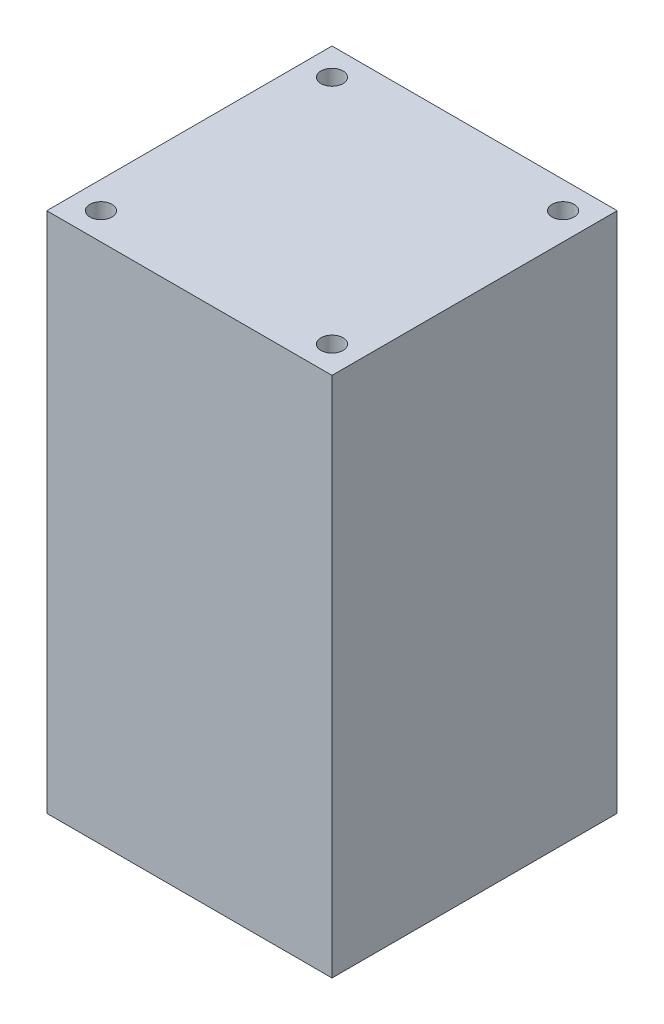
ISO-10303-21;
HEADER;
FILE_DESCRIPTION(('STEP AP214'),'2;1');
FILE_NAME('part.step','',(''),(''),'','','');
FILE_SCHEMA(('AUTOMOTIVE_DESIGN { 1 0 10303 214 1 1 1 1 }'));
ENDSEC;
DATA;
#1=APPLICATION_CONTEXT('core data for automotive mechanical design processes');
#2=APPLICATION_PROTOCOL_DEFINITION('international standard','automotive_design',2000,#1);
#3=PRODUCT_CONTEXT('',#1,'mechanical');
#4=PRODUCT('Part','Part','',(#3));
#5=PRODUCT_RELATED_PRODUCT_CATEGORY('part','',(#4));
#6=PRODUCT_DEFINITION_FORMATION('','',#4);
#7=PRODUCT_DEFINITION_CONTEXT('part definition',#1,'design');
#8=PRODUCT_DEFINITION('design','',#6,#7);
#9=PRODUCT_DEFINITION_SHAPE('','',#8);
#10=(LENGTH_UNIT() NAMED_UNIT(*) SI_UNIT(.MILLI.,.METRE.));
#11=(NAMED_UNIT(*) PLANE_ANGLE_UNIT() SI_UNIT($,.RADIAN.));
#12=(NAMED_UNIT(*) SI_UNIT($,.STERADIAN.) SOLID_ANGLE_UNIT());
#13=UNCERTAINTY_MEASURE_WITH_UNIT(LENGTH_MEASURE(1.E-05),#10,'distance_accuracy_value','');
#14=(GEOMETRIC_REPRESENTATION_CONTEXT(3) GLOBAL_UNCERTAINTY_ASSIGNED_CONTEXT((#13)) GLOBAL_UNIT_ASSIGNED_CONTEXT((#10,
#11,#12)) REPRESENTATION_CONTEXT('',''));
#15=CARTESIAN_POINT('',(0.,0.,0.));
#16=DIRECTION('',(0.,0.,1.));
#17=DIRECTION('',(1.,0.,0.));
#18=AXIS2_PLACEMENT_3D('',#15,#16,#17);
#19=CARTESIAN_POINT('',(54.93,-201.,54.93));
#20=DIRECTION('',(1.,0.,0.));
#21=DIRECTION('',(0.,0.,-1.));
#22=AXIS2_PLACEMENT_3D('',#19,#20,#21);
#23=PLANE('',#22);
#24=DIRECTION('',(0.,0.,-1.));
#25=VECTOR('',#24,1.);
#26=CARTESIAN_POINT('',(54.93,0.,54.93));
#27=LINE('',#26,#25);
#28=CARTESIAN_POINT('',(54.93,0.,54.93));
#29=VERTEX_POINT('',#28);
#30=CARTESIAN_POINT('',(54.93,0.,-54.93));
#31=VERTEX_POINT('',#30);
#32=EDGE_CURVE('E98',#29,#31,#27,.T.);
#33=ORIENTED_EDGE('',*,*,#32,.F.);
#34=DIRECTION('',(0.,1.,0.));
#35=VECTOR('',#34,1.);
#36=CARTESIAN_POINT('',(54.93,-201.,54.93));
#37=LINE('',#36,#35);
#38=CARTESIAN_POINT('',(54.93,-201.,54.93));
#39=VERTEX_POINT('',#38);
#40=EDGE_CURVE('E11',#39,#29,#37,.T.);
#41=ORIENTED_EDGE('',*,*,#40,.F.);
#42=DIRECTION('',(0.,0.,-1.));
#43=VECTOR('',#42,1.);
#44=CARTESIAN_POINT('',(54.93,-201.,54.93));
#45=LINE('',#44,#43);
#46=CARTESIAN_POINT('',(54.93,-201.,-54.93));
#47=VERTEX_POINT('',#46);
#48=EDGE_CURVE('E91',#39,#47,#45,.T.);
#49=ORIENTED_EDGE('',*,*,#48,.T.);
#50=DIRECTION('',(0.,1.,0.));
#51=VECTOR('',#50,1.);
#52=CARTESIAN_POINT('',(54.93,-201.,-54.93));
#53=LINE('',#52,#51);
#54=EDGE_CURVE('E36',#47,#31,#53,.T.);
#55=ORIENTED_EDGE('',*,*,#54,.T.);
#56=EDGE_LOOP('',(#33,#41,#49,#55));
#57=FACE_BOUND('',#56,.T.);
#58=ADVANCED_FACE('F33',(#57),#23,.T.);
#59=CARTESIAN_POINT('',(-54.93,-201.,54.93));
#60=DIRECTION('',(0.,0.,1.));
#61=DIRECTION('',(1.,0.,0.));
#62=AXIS2_PLACEMENT_3D('',#59,#60,#61);
#63=PLANE('',#62);
#64=DIRECTION('',(1.,0.,0.));
#65=VECTOR('',#64,1.);
#66=CARTESIAN_POINT('',(-54.93,0.,54.93));
#67=LINE('',#66,#65);
#68=CARTESIAN_POINT('',(-54.93,0.,54.93));
#69=VERTEX_POINT('',#68);
#70=EDGE_CURVE('E93',#69,#29,#67,.T.);
#71=ORIENTED_EDGE('',*,*,#70,.F.);
#72=DIRECTION('',(0.,1.,0.));
#73=VECTOR('',#72,1.);
#74=CARTESIAN_POINT('',(-54.93,-201.,54.93));
#75=LINE('',#74,#73);
#76=CARTESIAN_POINT('',(-54.93,-201.,54.93));
#77=VERTEX_POINT('',#76);
#78=EDGE_CURVE('E42',#77,#69,#75,.T.);
#79=ORIENTED_EDGE('',*,*,#78,.F.);
#80=DIRECTION('',(1.,0.,0.));
#81=VECTOR('',#80,1.);
#82=CARTESIAN_POINT('',(-54.93,-201.,54.93));
#83=LINE('',#82,#81);
#84=EDGE_CURVE('E88',#77,#39,#83,.T.);
#85=ORIENTED_EDGE('',*,*,#84,.T.);
#86=ORIENTED_EDGE('',*,*,#40,.T.);
#87=EDGE_LOOP('',(#71,#79,#85,#86));
#88=FACE_BOUND('',#87,.T.);
#89=ADVANCED_FACE('F109',(#88),#63,.T.);
#90=CARTESIAN_POINT('',(-54.93,-201.,54.93));
#91=DIRECTION('',(-1.,0.,0.));
#92=DIRECTION('',(0.,0.,1.));
#93=AXIS2_PLACEMENT_3D('',#90,#91,#92);
#94=PLANE('',#93);
#95=DIRECTION('',(0.,0.,1.));
#96=VECTOR('',#95,1.);
#97=CARTESIAN_POINT('',(-54.93,0.,54.93));
#98=LINE('',#97,#96);
#99=CARTESIAN_POINT('',(-54.93,0.,-54.93));
#100=VERTEX_POINT('',#99);
#101=EDGE_CURVE('E83',#100,#69,#98,.T.);
#102=ORIENTED_EDGE('',*,*,#101,.F.);
#103=DIRECTION('',(0.,1.,0.));
#104=VECTOR('',#103,1.);
#105=CARTESIAN_POINT('',(-54.93,-201.,-54.93));
#106=LINE('',#105,#104);
#107=CARTESIAN_POINT('',(-54.93,-201.,-54.93));
#108=VERTEX_POINT('',#107);
#109=EDGE_CURVE('E78',#108,#100,#106,.T.);
#110=ORIENTED_EDGE('',*,*,#109,.F.);
#111=DIRECTION('',(0.,0.,1.));
#112=VECTOR('',#111,1.);
#113=CARTESIAN_POINT('',(-54.93,-201.,54.93));
#114=LINE('',#113,#112);
#115=EDGE_CURVE('E81',#108,#77,#114,.T.);
#116=ORIENTED_EDGE('',*,*,#115,.T.);
#117=ORIENTED_EDGE('',*,*,#78,.T.);
#118=EDGE_LOOP('',(#102,#110,#116,#117));
#119=FACE_BOUND('',#118,.T.);
#120=ADVANCED_FACE('F80',(#119),#94,.T.);
#121=CARTESIAN_POINT('',(-54.93,-201.,-54.93));
#122=DIRECTION('',(0.,0.,-1.));
#123=DIRECTION('',(-1.,0.,0.));
#124=AXIS2_PLACEMENT_3D('',#121,#122,#123);
#125=PLANE('',#124);
#126=DIRECTION('',(-1.,0.,0.));
#127=VECTOR('',#126,1.);
#128=CARTESIAN_POINT('',(-54.93,0.,-54.93));
#129=LINE('',#128,#127);
#130=EDGE_CURVE('E101',#31,#100,#129,.T.);
#131=ORIENTED_EDGE('',*,*,#130,.F.);
#132=ORIENTED_EDGE('',*,*,#54,.F.);
#133=DIRECTION('',(-1.,0.,0.));
#134=VECTOR('',#133,1.);
#135=CARTESIAN_POINT('',(-54.93,-201.,-54.93));
#136=LINE('',#135,#134);
#137=EDGE_CURVE('E87',#47,#108,#136,.T.);
#138=ORIENTED_EDGE('',*,*,#137,.T.);
#139=ORIENTED_EDGE('',*,*,#109,.T.);
#140=EDGE_LOOP('',(#131,#132,#138,#139));
#141=FACE_BOUND('',#140,.T.);
#142=ADVANCED_FACE('F90',(#141),#125,.T.);
#143=CARTESIAN_POINT('',(0.,-201.,0.));
#144=DIRECTION('',(0.,-1.,0.));
#145=DIRECTION('',(0.,0.,-1.));
#146=AXIS2_PLACEMENT_3D('',#143,#144,#145);
#147=PLANE('',#146);
#148=CARTESIAN_POINT('',(-44.5,-201.,44.5));
#149=DIRECTION('',(0.,1.,0.));
#150=DIRECTION('',(0.,0.,1.));
#151=AXIS2_PLACEMENT_3D('',#148,#149,#150);
#152=CIRCLE('',#151,4.25000000000001);
#153=CARTESIAN_POINT('',(-44.5,-201.,48.75));
#154=VERTEX_POINT('',#153);
#155=EDGE_CURVE('E150',#154,#154,#152,.T.);
#156=ORIENTED_EDGE('',*,*,#155,.T.);
#157=EDGE_LOOP('',(#156));
#158=FACE_BOUND('',#157,.T.);
#159=CARTESIAN_POINT('',(44.5,-201.,44.5));
#160=DIRECTION('',(0.,1.,0.));
#161=DIRECTION('',(0.,0.,1.));
#162=AXIS2_PLACEMENT_3D('',#159,#160,#161);
#163=CIRCLE('',#162,4.25000000000001);
#164=CARTESIAN_POINT('',(44.5,-201.,48.75));
#165=VERTEX_POINT('',#164);
#166=EDGE_CURVE('E158',#165,#165,#163,.T.);
#167=ORIENTED_EDGE('',*,*,#166,.T.);
#168=EDGE_LOOP('',(#167));
#169=FACE_BOUND('',#168,.T.);
#170=CARTESIAN_POINT('',(44.5,-201.,-44.5));
#171=DIRECTION('',(0.,1.,0.));
#172=DIRECTION('',(0.,0.,1.));
#173=AXIS2_PLACEMENT_3D('',#170,#171,#172);
#174=CIRCLE('',#173,4.25000000000001);
#175=CARTESIAN_POINT('',(44.5,-201.,-40.25));
#176=VERTEX_POINT('',#175);
#177=EDGE_CURVE('E164',#176,#176,#174,.T.);
#178=ORIENTED_EDGE('',*,*,#177,.T.);
#179=EDGE_LOOP('',(#178));
#180=FACE_BOUND('',#179,.T.);
#181=CARTESIAN_POINT('',(-44.5,-201.,-44.5));
#182=DIRECTION('',(0.,1.,0.));
#183=DIRECTION('',(0.,0.,1.));
#184=AXIS2_PLACEMENT_3D('',#181,#182,#183);
#185=CIRCLE('',#184,4.25000000000001);
#186=CARTESIAN_POINT('',(-44.5,-201.,-40.25));
#187=VERTEX_POINT('',#186);
#188=EDGE_CURVE('E102',#187,#187,#185,.T.);
#189=ORIENTED_EDGE('',*,*,#188,.T.);
#190=EDGE_LOOP('',(#189));
#191=FACE_BOUND('',#190,.T.);
#192=ORIENTED_EDGE('',*,*,#48,.F.);
#193=ORIENTED_EDGE('',*,*,#84,.F.);
#194=ORIENTED_EDGE('',*,*,#115,.F.);
#195=ORIENTED_EDGE('',*,*,#137,.F.);
#196=EDGE_LOOP('',(#192,#193,#194,#195));
#197=FACE_BOUND('',#196,.T.);
#198=ADVANCED_FACE('F86',(#158,#169,#180,#191,#197),#147,.T.);
#199=CARTESIAN_POINT('',(0.,0.,0.));
#200=DIRECTION('',(0.,-1.,0.));
#201=DIRECTION('',(0.,0.,-1.));
#202=AXIS2_PLACEMENT_3D('',#199,#200,#201);
#203=PLANE('',#202);
#204=CARTESIAN_POINT('',(-44.5,0.,44.5));
#205=DIRECTION('',(0.,1.,0.));
#206=DIRECTION('',(0.,0.,1.));
#207=AXIS2_PLACEMENT_3D('',#204,#205,#206);
#208=CIRCLE('',#207,4.25000000000001);
#209=CARTESIAN_POINT('',(-44.5,0.,48.75));
#210=VERTEX_POINT('',#209);
#211=EDGE_CURVE('E153',#210,#210,#208,.T.);
#212=ORIENTED_EDGE('',*,*,#211,.F.);
#213=EDGE_LOOP('',(#212));
#214=FACE_BOUND('',#213,.T.);
#215=CARTESIAN_POINT('',(44.5,0.,44.5));
#216=DIRECTION('',(0.,1.,0.));
#217=DIRECTION('',(0.,0.,1.));
#218=AXIS2_PLACEMENT_3D('',#215,#216,#217);
#219=CIRCLE('',#218,4.25000000000001);
#220=CARTESIAN_POINT('',(44.5,0.,48.75));
#221=VERTEX_POINT('',#220);
#222=EDGE_CURVE('E155',#221,#221,#219,.T.);
#223=ORIENTED_EDGE('',*,*,#222,.F.);
#224=EDGE_LOOP('',(#223));
#225=FACE_BOUND('',#224,.T.);
#226=CARTESIAN_POINT('',(44.5,0.,-44.5));
#227=DIRECTION('',(0.,1.,0.));
#228=DIRECTION('',(0.,0.,1.));
#229=AXIS2_PLACEMENT_3D('',#226,#227,#228);
#230=CIRCLE('',#229,4.25000000000001);
#231=CARTESIAN_POINT('',(44.5,0.,-40.25));
#232=VERTEX_POINT('',#231);
#233=EDGE_CURVE('E161',#232,#232,#230,.T.);
#234=ORIENTED_EDGE('',*,*,#233,.F.);
#235=EDGE_LOOP('',(#234));
#236=FACE_BOUND('',#235,.T.);
#237=CARTESIAN_POINT('',(-44.5,0.,-44.5));
#238=DIRECTION('',(0.,1.,0.));
#239=DIRECTION('',(0.,0.,1.));
#240=AXIS2_PLACEMENT_3D('',#237,#238,#239);
#241=CIRCLE('',#240,4.25000000000001);
#242=CARTESIAN_POINT('',(-44.5,0.,-40.25));
#243=VERTEX_POINT('',#242);
#244=EDGE_CURVE('E167',#243,#243,#241,.T.);
#245=ORIENTED_EDGE('',*,*,#244,.F.);
#246=EDGE_LOOP('',(#245));
#247=FACE_BOUND('',#246,.T.);
#248=ORIENTED_EDGE('',*,*,#32,.T.);
#249=ORIENTED_EDGE('',*,*,#130,.T.);
#250=ORIENTED_EDGE('',*,*,#101,.T.);
#251=ORIENTED_EDGE('',*,*,#70,.T.);
#252=EDGE_LOOP('',(#248,#249,#250,#251));
#253=FACE_BOUND('',#252,.T.);
#254=ADVANCED_FACE('F108',(#214,#225,#236,#247,#253),#203,.F.);
#255=CARTESIAN_POINT('',(-44.5,-201.,-44.5));
#256=DIRECTION('',(0.,1.,0.));
#257=DIRECTION('',(0.,0.,1.));
#258=AXIS2_PLACEMENT_3D('',#255,#256,#257);
#259=CYLINDRICAL_SURFACE('',#258,4.25000000000001);
#260=ORIENTED_EDGE('',*,*,#188,.F.);
#261=EDGE_LOOP('',(#260));
#262=FACE_BOUND('',#261,.T.);
#263=ORIENTED_EDGE('',*,*,#244,.T.);
#264=EDGE_LOOP('',(#263));
#265=FACE_BOUND('',#264,.T.);
#266=ADVANCED_FACE('F127',(#262,#265),#259,.F.);
#267=CARTESIAN_POINT('',(44.5,-201.,-44.5));
#268=DIRECTION('',(0.,1.,0.));
#269=DIRECTION('',(0.,0.,1.));
#270=AXIS2_PLACEMENT_3D('',#267,#268,#269);
#271=CYLINDRICAL_SURFACE('',#270,4.25000000000001);
#272=ORIENTED_EDGE('',*,*,#177,.F.);
#273=EDGE_LOOP('',(#272));
#274=FACE_BOUND('',#273,.T.);
#275=ORIENTED_EDGE('',*,*,#233,.T.);
#276=EDGE_LOOP('',(#275));
#277=FACE_BOUND('',#276,.T.);
#278=ADVANCED_FACE('F134',(#274,#277),#271,.F.);
#279=CARTESIAN_POINT('',(44.5,-201.,44.5));
#280=DIRECTION('',(0.,1.,0.));
#281=DIRECTION('',(0.,0.,1.));
#282=AXIS2_PLACEMENT_3D('',#279,#280,#281);
#283=CYLINDRICAL_SURFACE('',#282,4.25000000000001);
#284=ORIENTED_EDGE('',*,*,#166,.F.);
#285=EDGE_LOOP('',(#284));
#286=FACE_BOUND('',#285,.T.);
#287=ORIENTED_EDGE('',*,*,#222,.T.);
#288=EDGE_LOOP('',(#287));
#289=FACE_BOUND('',#288,.T.);
#290=ADVANCED_FACE('F138',(#286,#289),#283,.F.);
#291=CARTESIAN_POINT('',(-44.5,-201.,44.5));
#292=DIRECTION('',(0.,1.,0.));
#293=DIRECTION('',(0.,0.,1.));
#294=AXIS2_PLACEMENT_3D('',#291,#292,#293);
#295=CYLINDRICAL_SURFACE('',#294,4.25000000000001);
#296=ORIENTED_EDGE('',*,*,#155,.F.);
#297=EDGE_LOOP('',(#296));
#298=FACE_BOUND('',#297,.T.);
#299=ORIENTED_EDGE('',*,*,#211,.T.);
#300=EDGE_LOOP('',(#299));
#301=FACE_BOUND('',#300,.T.);
#302=ADVANCED_FACE('F142',(#298,#301),#295,.F.);
#303=CLOSED_SHELL('',(#58,#89,#120,#142,#198,#254,#266,#278,#290,#302));
#304=MANIFOLD_SOLID_BREP('B2',#303);
#305=ADVANCED_BREP_SHAPE_REPRESENTATION('',(#18,#304),#14);
#306=SHAPE_DEFINITION_REPRESENTATION(#9,#305);
ENDSEC;
END-ISO-10303-21;
